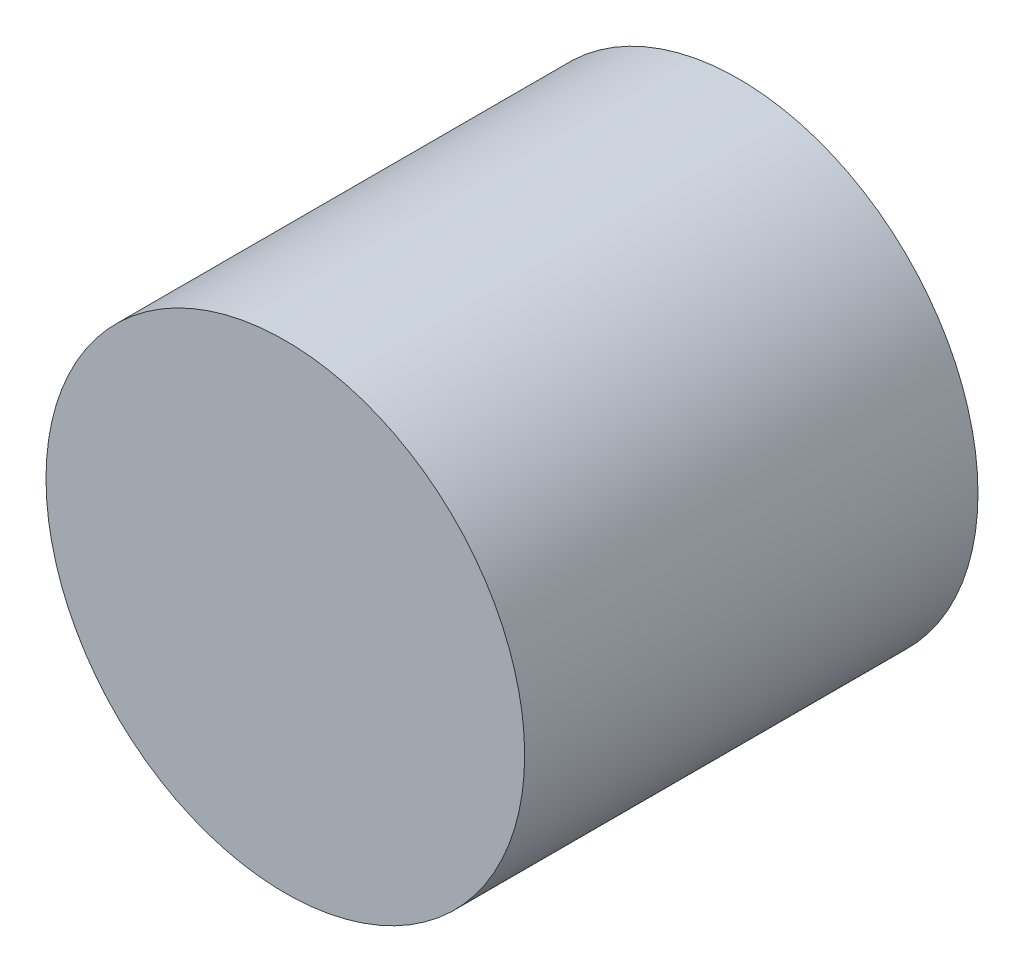
ISO-10303-21;
HEADER;
FILE_DESCRIPTION(('STEP AP214'),'2;1');
FILE_NAME('part.step','',(''),(''),'','','');
FILE_SCHEMA(('AUTOMOTIVE_DESIGN { 1 0 10303 214 1 1 1 1 }'));
ENDSEC;
DATA;
#1=APPLICATION_CONTEXT('core data for automotive mechanical design processes');
#2=APPLICATION_PROTOCOL_DEFINITION('international standard','automotive_design',2000,#1);
#3=PRODUCT_CONTEXT('',#1,'mechanical');
#4=PRODUCT('Part','Part','',(#3));
#5=PRODUCT_RELATED_PRODUCT_CATEGORY('part','',(#4));
#6=PRODUCT_DEFINITION_FORMATION('','',#4);
#7=PRODUCT_DEFINITION_CONTEXT('part definition',#1,'design');
#8=PRODUCT_DEFINITION('design','',#6,#7);
#9=PRODUCT_DEFINITION_SHAPE('','',#8);
#10=(LENGTH_UNIT() NAMED_UNIT(*) SI_UNIT(.MILLI.,.METRE.));
#11=(NAMED_UNIT(*) PLANE_ANGLE_UNIT() SI_UNIT($,.RADIAN.));
#12=(NAMED_UNIT(*) SI_UNIT($,.STERADIAN.) SOLID_ANGLE_UNIT());
#13=UNCERTAINTY_MEASURE_WITH_UNIT(LENGTH_MEASURE(1.E-05),#10,'distance_accuracy_value','');
#14=(GEOMETRIC_REPRESENTATION_CONTEXT(3) GLOBAL_UNCERTAINTY_ASSIGNED_CONTEXT((#13)) GLOBAL_UNIT_ASSIGNED_CONTEXT((#10,
#11,#12)) REPRESENTATION_CONTEXT('',''));
#15=CARTESIAN_POINT('',(0.,0.,0.));
#16=DIRECTION('',(0.,0.,1.));
#17=DIRECTION('',(1.,0.,0.));
#18=AXIS2_PLACEMENT_3D('',#15,#16,#17);
#19=CARTESIAN_POINT('',(0.,0.,90.));
#20=DIRECTION('',(0.,0.,-1.));
#21=DIRECTION('',(-1.,0.,0.));
#22=AXIS2_PLACEMENT_3D('',#19,#20,#21);
#23=CYLINDRICAL_SURFACE('',#22,47.511973794328);
#24=CARTESIAN_POINT('',(0.,0.,90.));
#25=DIRECTION('',(0.,0.,1.));
#26=DIRECTION('',(1.,0.,0.));
#27=AXIS2_PLACEMENT_3D('',#24,#25,#26);
#28=CIRCLE('',#27,47.511973794328);
#29=CARTESIAN_POINT('',(-47.511973794328,0.,90.));
#30=VERTEX_POINT('',#29);
#31=EDGE_CURVE('E10',#30,#30,#28,.T.);
#32=CARTESIAN_POINT('',(0.,0.,0.));
#33=DIRECTION('',(0.,0.,1.));
#34=DIRECTION('',(1.,0.,0.));
#35=AXIS2_PLACEMENT_3D('',#32,#33,#34);
#36=CIRCLE('',#35,47.511973794328);
#37=CARTESIAN_POINT('',(-47.511973794328,0.,0.));
#38=VERTEX_POINT('',#37);
#39=EDGE_CURVE('E48',#38,#38,#36,.T.);
#40=CARTESIAN_POINT('',(-47.511973794328,0.,90.));
#41=CARTESIAN_POINT('',(-47.511973794328,0.,89.0625));
#42=CARTESIAN_POINT('',(-47.511973794328,0.,88.125));
#43=CARTESIAN_POINT('',(-47.511973794328,0.,86.25));
#44=CARTESIAN_POINT('',(-47.511973794328,0.,85.3125));
#45=CARTESIAN_POINT('',(-47.511973794328,0.,83.4375));
#46=CARTESIAN_POINT('',(-47.511973794328,0.,82.5));
#47=CARTESIAN_POINT('',(-47.511973794328,0.,80.625));
#48=CARTESIAN_POINT('',(-47.511973794328,0.,79.6875));
#49=CARTESIAN_POINT('',(-47.511973794328,0.,77.8125));
#50=CARTESIAN_POINT('',(-47.511973794328,0.,76.875));
#51=CARTESIAN_POINT('',(-47.511973794328,0.,75.));
#52=CARTESIAN_POINT('',(-47.511973794328,0.,74.0625));
#53=CARTESIAN_POINT('',(-47.511973794328,0.,72.1875));
#54=CARTESIAN_POINT('',(-47.511973794328,0.,71.25));
#55=CARTESIAN_POINT('',(-47.511973794328,0.,69.375));
#56=CARTESIAN_POINT('',(-47.511973794328,0.,68.4375));
#57=CARTESIAN_POINT('',(-47.511973794328,0.,66.5625));
#58=CARTESIAN_POINT('',(-47.511973794328,0.,65.625));
#59=CARTESIAN_POINT('',(-47.511973794328,0.,63.75));
#60=CARTESIAN_POINT('',(-47.511973794328,0.,62.8125));
#61=CARTESIAN_POINT('',(-47.511973794328,0.,60.9375));
#62=CARTESIAN_POINT('',(-47.511973794328,0.,60.));
#63=CARTESIAN_POINT('',(-47.511973794328,0.,58.125));
#64=CARTESIAN_POINT('',(-47.511973794328,0.,57.1875));
#65=CARTESIAN_POINT('',(-47.511973794328,0.,55.3125));
#66=CARTESIAN_POINT('',(-47.511973794328,0.,54.375));
#67=CARTESIAN_POINT('',(-47.511973794328,0.,52.5));
#68=CARTESIAN_POINT('',(-47.511973794328,0.,51.5625));
#69=CARTESIAN_POINT('',(-47.511973794328,0.,49.6875));
#70=CARTESIAN_POINT('',(-47.511973794328,0.,48.75));
#71=CARTESIAN_POINT('',(-47.511973794328,0.,46.875));
#72=CARTESIAN_POINT('',(-47.511973794328,0.,45.9375));
#73=CARTESIAN_POINT('',(-47.511973794328,0.,44.0625));
#74=CARTESIAN_POINT('',(-47.511973794328,0.,43.125));
#75=CARTESIAN_POINT('',(-47.511973794328,0.,41.25));
#76=CARTESIAN_POINT('',(-47.511973794328,0.,40.3125));
#77=CARTESIAN_POINT('',(-47.511973794328,0.,38.4375));
#78=CARTESIAN_POINT('',(-47.511973794328,0.,37.5));
#79=CARTESIAN_POINT('',(-47.511973794328,0.,35.625));
#80=CARTESIAN_POINT('',(-47.511973794328,0.,34.6875));
#81=CARTESIAN_POINT('',(-47.511973794328,0.,32.8125));
#82=CARTESIAN_POINT('',(-47.511973794328,0.,31.875));
#83=CARTESIAN_POINT('',(-47.511973794328,0.,30.));
#84=CARTESIAN_POINT('',(-47.511973794328,0.,29.0625));
#85=CARTESIAN_POINT('',(-47.511973794328,0.,27.1875));
#86=CARTESIAN_POINT('',(-47.511973794328,0.,26.25));
#87=CARTESIAN_POINT('',(-47.511973794328,0.,24.375));
#88=CARTESIAN_POINT('',(-47.511973794328,0.,23.4375));
#89=CARTESIAN_POINT('',(-47.511973794328,0.,21.5625));
#90=CARTESIAN_POINT('',(-47.511973794328,0.,20.625));
#91=CARTESIAN_POINT('',(-47.511973794328,0.,18.75));
#92=CARTESIAN_POINT('',(-47.511973794328,0.,17.8125));
#93=CARTESIAN_POINT('',(-47.511973794328,0.,15.9375));
#94=CARTESIAN_POINT('',(-47.511973794328,0.,15.));
#95=CARTESIAN_POINT('',(-47.511973794328,0.,13.125));
#96=CARTESIAN_POINT('',(-47.511973794328,0.,12.1875));
#97=CARTESIAN_POINT('',(-47.511973794328,0.,10.3125));
#98=CARTESIAN_POINT('',(-47.511973794328,0.,9.37499999999999));
#99=CARTESIAN_POINT('',(-47.511973794328,0.,7.49999999999999));
#100=CARTESIAN_POINT('',(-47.511973794328,0.,6.56249999999999));
#101=CARTESIAN_POINT('',(-47.511973794328,0.,4.68749999999999));
#102=CARTESIAN_POINT('',(-47.511973794328,0.,3.74999999999998));
#103=CARTESIAN_POINT('',(-47.511973794328,0.,1.87499999999998));
#104=CARTESIAN_POINT('',(-47.511973794328,0.,0.937499999999986));
#105=CARTESIAN_POINT('',(-47.511973794328,0.,0.));
#106=B_SPLINE_CURVE_WITH_KNOTS('',3,(#40,#41,#42,#43,#44,#45,#46,#47,#48,#49,#50,#51,#52,#53,
#54,#55,#56,#57,#58,#59,#60,#61,#62,#63,#64,#65,#66,#67,#68,#69,#70,#71,#72,#73,#74,#75,#76,#77,
#78,#79,#80,#81,#82,#83,#84,#85,#86,#87,#88,#89,#90,#91,#92,#93,#94,#95,#96,#97,#98,#99,#100,
#101,#102,#103,#104,#105),.UNSPECIFIED.,.F.,.F.,(4,2,2,2,2,2,2,2,2,2,2,2,2,2,2,2,2,2,2,2,2,2,2,
2,2,2,2,2,2,2,2,2,4),(0.,2.81250000000001,5.62500000000001,8.43750000000001,11.25,14.0625,
16.875,19.6875,22.5,25.3125,28.125,30.9375,33.75,36.5625,39.375,42.1875,45.,47.8125,50.625,
53.4375,56.25,59.0625,61.875,64.6875,67.5,70.3125,73.125,75.9375,78.75,81.5625,84.375,87.1875,
90.),.UNSPECIFIED.);
#107=EDGE_CURVE('BSEAM45',#30,#38,#106,.T.);
#108=ORIENTED_EDGE('',*,*,#31,.F.);
#109=ORIENTED_EDGE('',*,*,#39,.T.);
#110=ORIENTED_EDGE('',*,*,#107,.T.);
#111=ORIENTED_EDGE('',*,*,#107,.F.);
#112=EDGE_LOOP('',(#108,#110,#109,#111));
#113=FACE_BOUND('',#112,.T.);
#114=ADVANCED_FACE('F45',(#113),#23,.T.);
#115=CARTESIAN_POINT('',(0.,0.,90.));
#116=DIRECTION('',(0.,0.,1.));
#117=DIRECTION('',(1.,0.,0.));
#118=AXIS2_PLACEMENT_3D('',#115,#116,#117);
#119=PLANE('',#118);
#120=ORIENTED_EDGE('',*,*,#31,.T.);
#121=EDGE_LOOP('',(#120));
#122=FACE_BOUND('',#121,.T.);
#123=ADVANCED_FACE('F62',(#122),#119,.T.);
#124=CARTESIAN_POINT('',(0.,0.,0.));
#125=DIRECTION('',(0.,0.,1.));
#126=DIRECTION('',(1.,0.,0.));
#127=AXIS2_PLACEMENT_3D('',#124,#125,#126);
#128=PLANE('',#127);
#129=ORIENTED_EDGE('',*,*,#39,.F.);
#130=EDGE_LOOP('',(#129));
#131=FACE_BOUND('',#130,.T.);
#132=ADVANCED_FACE('F60',(#131),#128,.F.);
#133=CLOSED_SHELL('',(#114,#123,#132));
#134=MANIFOLD_SOLID_BREP('B2',#133);
#135=ADVANCED_BREP_SHAPE_REPRESENTATION('',(#18,#134),#14);
#136=SHAPE_DEFINITION_REPRESENTATION(#9,#135);
ENDSEC;
END-ISO-10303-21;
